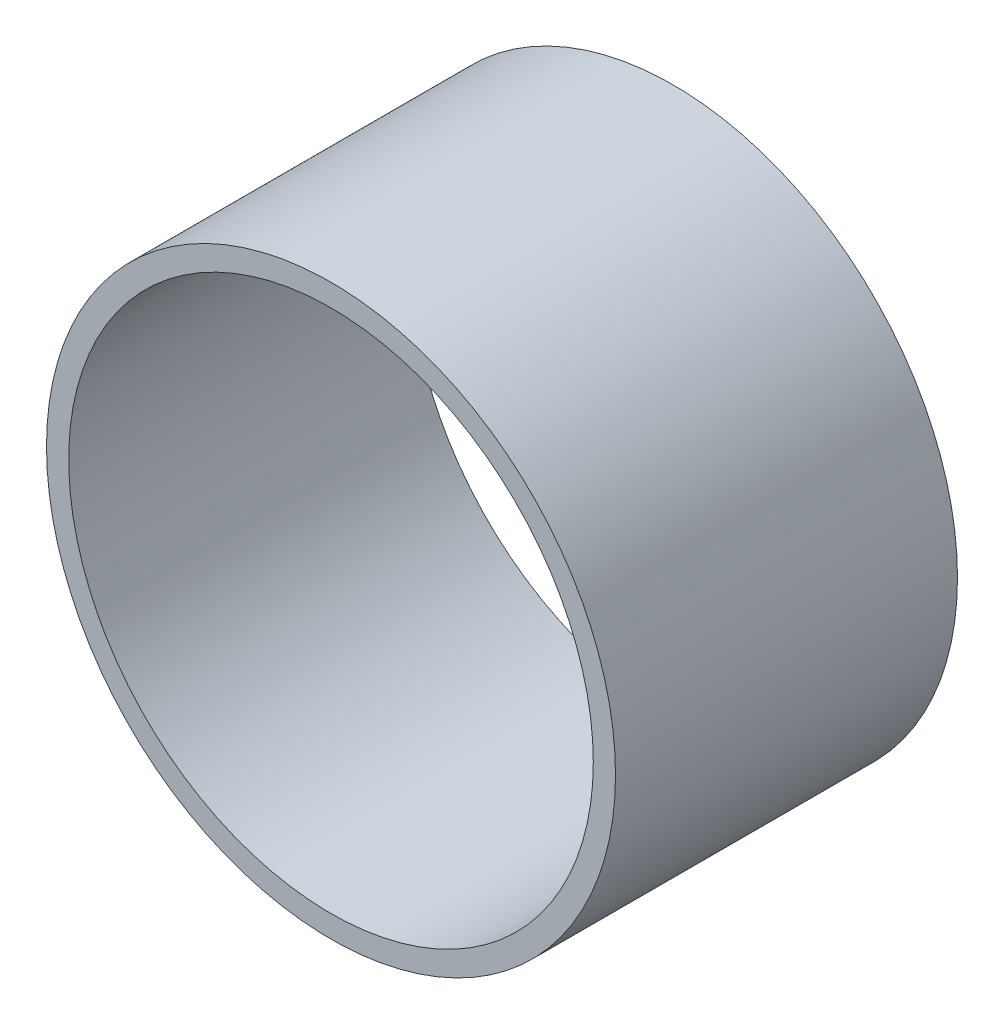
ISO-10303-21;
HEADER;
FILE_DESCRIPTION(('STEP AP214'),'2;1');
FILE_NAME('part.step','',(''),(''),'','','');
FILE_SCHEMA(('AUTOMOTIVE_DESIGN { 1 0 10303 214 1 1 1 1 }'));
ENDSEC;
DATA;
#1=APPLICATION_CONTEXT('core data for automotive mechanical design processes');
#2=APPLICATION_PROTOCOL_DEFINITION('international standard','automotive_design',2000,#1);
#3=PRODUCT_CONTEXT('',#1,'mechanical');
#4=PRODUCT('Part','Part','',(#3));
#5=PRODUCT_RELATED_PRODUCT_CATEGORY('part','',(#4));
#6=PRODUCT_DEFINITION_FORMATION('','',#4);
#7=PRODUCT_DEFINITION_CONTEXT('part definition',#1,'design');
#8=PRODUCT_DEFINITION('design','',#6,#7);
#9=PRODUCT_DEFINITION_SHAPE('','',#8);
#10=(LENGTH_UNIT() NAMED_UNIT(*) SI_UNIT(.MILLI.,.METRE.));
#11=(NAMED_UNIT(*) PLANE_ANGLE_UNIT() SI_UNIT($,.RADIAN.));
#12=(NAMED_UNIT(*) SI_UNIT($,.STERADIAN.) SOLID_ANGLE_UNIT());
#13=UNCERTAINTY_MEASURE_WITH_UNIT(LENGTH_MEASURE(1.E-05),#10,'distance_accuracy_value','');
#14=(GEOMETRIC_REPRESENTATION_CONTEXT(3) GLOBAL_UNCERTAINTY_ASSIGNED_CONTEXT((#13)) GLOBAL_UNIT_ASSIGNED_CONTEXT((#10,
#11,#12)) REPRESENTATION_CONTEXT('',''));
#15=CARTESIAN_POINT('',(0.,0.,0.));
#16=DIRECTION('',(0.,0.,1.));
#17=DIRECTION('',(1.,0.,0.));
#18=AXIS2_PLACEMENT_3D('',#15,#16,#17);
#19=CARTESIAN_POINT('',(0.,0.,0.));
#20=DIRECTION('',(0.,0.,-1.));
#21=DIRECTION('',(1.,0.,0.));
#22=AXIS2_PLACEMENT_3D('',#19,#20,#21);
#23=CYLINDRICAL_SURFACE('',#22,0.3253994);
#24=CARTESIAN_POINT('',(0.,0.,0.39116));
#25=DIRECTION('',(0.,0.,1.));
#26=DIRECTION('',(1.,0.,0.));
#27=AXIS2_PLACEMENT_3D('',#24,#25,#26);
#28=CIRCLE('',#27,0.3253994);
#29=CARTESIAN_POINT('',(0.3253994,0.,0.39116));
#30=VERTEX_POINT('',#29);
#31=EDGE_CURVE('E11',#30,#30,#28,.T.);
#32=ORIENTED_EDGE('',*,*,#31,.F.);
#33=DIRECTION('',(0.,0.,1.));
#34=VECTOR('',#33,1.);
#35=CARTESIAN_POINT('',(0.3253994,0.,0.));
#36=LINE('',#35,#34);
#37=CARTESIAN_POINT('',(0.3253994,0.,0.));
#38=VERTEX_POINT('',#37);
#39=EDGE_CURVE('E24',#38,#30,#36,.T.);
#40=ORIENTED_EDGE('',*,*,#39,.F.);
#41=CARTESIAN_POINT('',(0.,0.,0.));
#42=DIRECTION('',(0.,0.,1.));
#43=DIRECTION('',(1.,0.,0.));
#44=AXIS2_PLACEMENT_3D('',#41,#42,#43);
#45=CIRCLE('',#44,0.3253994);
#46=EDGE_CURVE('E46',#38,#38,#45,.T.);
#47=ORIENTED_EDGE('',*,*,#46,.T.);
#48=ORIENTED_EDGE('',*,*,#39,.T.);
#49=EDGE_LOOP('',(#32,#40,#47,#48));
#50=FACE_BOUND('',#49,.T.);
#51=ADVANCED_FACE('F17',(#50),#23,.T.);
#52=CARTESIAN_POINT('',(0.,0.,0.));
#53=DIRECTION('',(0.,0.,-1.));
#54=DIRECTION('',(1.,0.,0.));
#55=AXIS2_PLACEMENT_3D('',#52,#53,#54);
#56=CYLINDRICAL_SURFACE('',#55,0.2999994);
#57=DIRECTION('',(0.,0.,1.));
#58=VECTOR('',#57,1.);
#59=CARTESIAN_POINT('',(0.2999994,0.,0.));
#60=LINE('',#59,#58);
#61=CARTESIAN_POINT('',(0.2999994,0.,0.));
#62=VERTEX_POINT('',#61);
#63=CARTESIAN_POINT('',(0.2999994,0.,0.39116));
#64=VERTEX_POINT('',#63);
#65=EDGE_CURVE('E40',#62,#64,#60,.T.);
#66=ORIENTED_EDGE('',*,*,#65,.T.);
#67=CARTESIAN_POINT('',(0.,0.,0.39116));
#68=DIRECTION('',(0.,0.,1.));
#69=DIRECTION('',(1.,0.,0.));
#70=AXIS2_PLACEMENT_3D('',#67,#68,#69);
#71=CIRCLE('',#70,0.2999994);
#72=EDGE_CURVE('E45',#64,#64,#71,.T.);
#73=ORIENTED_EDGE('',*,*,#72,.T.);
#74=ORIENTED_EDGE('',*,*,#65,.F.);
#75=CARTESIAN_POINT('',(0.,0.,0.));
#76=DIRECTION('',(0.,0.,1.));
#77=DIRECTION('',(1.,0.,0.));
#78=AXIS2_PLACEMENT_3D('',#75,#76,#77);
#79=CIRCLE('',#78,0.2999994);
#80=EDGE_CURVE('E43',#62,#62,#79,.T.);
#81=ORIENTED_EDGE('',*,*,#80,.F.);
#82=EDGE_LOOP('',(#66,#73,#74,#81));
#83=FACE_BOUND('',#82,.T.);
#84=ADVANCED_FACE('F42',(#83),#56,.F.);
#85=CARTESIAN_POINT('',(0.3253994,0.,0.));
#86=DIRECTION('',(0.,0.,-1.));
#87=DIRECTION('',(-1.,0.,0.));
#88=AXIS2_PLACEMENT_3D('',#85,#86,#87);
#89=PLANE('',#88);
#90=ORIENTED_EDGE('',*,*,#46,.F.);
#91=EDGE_LOOP('',(#90));
#92=FACE_BOUND('',#91,.T.);
#93=ORIENTED_EDGE('',*,*,#80,.T.);
#94=EDGE_LOOP('',(#93));
#95=FACE_BOUND('',#94,.T.);
#96=ADVANCED_FACE('F49',(#92,#95),#89,.T.);
#97=CARTESIAN_POINT('',(0.3253994,0.,0.39116));
#98=DIRECTION('',(0.,0.,-1.));
#99=DIRECTION('',(-1.,0.,0.));
#100=AXIS2_PLACEMENT_3D('',#97,#98,#99);
#101=PLANE('',#100);
#102=ORIENTED_EDGE('',*,*,#31,.T.);
#103=EDGE_LOOP('',(#102));
#104=FACE_BOUND('',#103,.T.);
#105=ORIENTED_EDGE('',*,*,#72,.F.);
#106=EDGE_LOOP('',(#105));
#107=FACE_BOUND('',#106,.T.);
#108=ADVANCED_FACE('F56',(#104,#107),#101,.F.);
#109=CLOSED_SHELL('',(#51,#84,#96,#108));
#110=MANIFOLD_SOLID_BREP('B1',#109);
#111=ADVANCED_BREP_SHAPE_REPRESENTATION('',(#18,#110),#14);
#112=SHAPE_DEFINITION_REPRESENTATION(#9,#111);
ENDSEC;
END-ISO-10303-21;
